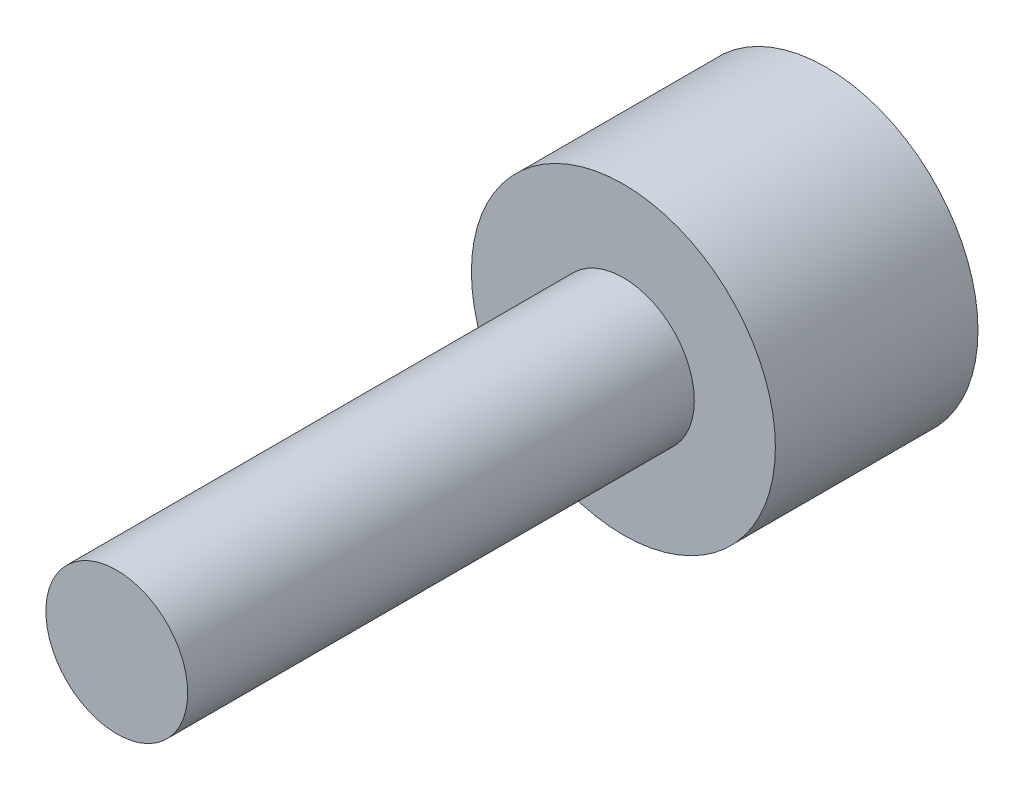
ISO-10303-21;
HEADER;
FILE_DESCRIPTION(('STEP AP214'),'2;1');
FILE_NAME('part.step','',(''),(''),'','','');
FILE_SCHEMA(('AUTOMOTIVE_DESIGN { 1 0 10303 214 1 1 1 1 }'));
ENDSEC;
DATA;
#1=APPLICATION_CONTEXT('core data for automotive mechanical design processes');
#2=APPLICATION_PROTOCOL_DEFINITION('international standard','automotive_design',2000,#1);
#3=PRODUCT_CONTEXT('',#1,'mechanical');
#4=PRODUCT('Part','Part','',(#3));
#5=PRODUCT_RELATED_PRODUCT_CATEGORY('part','',(#4));
#6=PRODUCT_DEFINITION_FORMATION('','',#4);
#7=PRODUCT_DEFINITION_CONTEXT('part definition',#1,'design');
#8=PRODUCT_DEFINITION('design','',#6,#7);
#9=PRODUCT_DEFINITION_SHAPE('','',#8);
#10=(LENGTH_UNIT() NAMED_UNIT(*) SI_UNIT(.MILLI.,.METRE.));
#11=(NAMED_UNIT(*) PLANE_ANGLE_UNIT() SI_UNIT($,.RADIAN.));
#12=(NAMED_UNIT(*) SI_UNIT($,.STERADIAN.) SOLID_ANGLE_UNIT());
#13=UNCERTAINTY_MEASURE_WITH_UNIT(LENGTH_MEASURE(1.E-05),#10,'distance_accuracy_value','');
#14=(GEOMETRIC_REPRESENTATION_CONTEXT(3) GLOBAL_UNCERTAINTY_ASSIGNED_CONTEXT((#13)) GLOBAL_UNIT_ASSIGNED_CONTEXT((#10,
#11,#12)) REPRESENTATION_CONTEXT('',''));
#15=CARTESIAN_POINT('',(0.,0.,0.));
#16=DIRECTION('',(0.,0.,1.));
#17=DIRECTION('',(1.,0.,0.));
#18=AXIS2_PLACEMENT_3D('',#15,#16,#17);
#19=CARTESIAN_POINT('',(0.,0.,35.));
#20=DIRECTION('',(0.,0.,-1.));
#21=DIRECTION('',(-1.,0.,0.));
#22=AXIS2_PLACEMENT_3D('',#19,#20,#21);
#23=CYLINDRICAL_SURFACE('',#22,3.5);
#24=CARTESIAN_POINT('',(0.,0.,35.));
#25=DIRECTION('',(0.,0.,1.));
#26=DIRECTION('',(1.,0.,0.));
#27=AXIS2_PLACEMENT_3D('',#24,#25,#26);
#28=CIRCLE('',#27,3.5);
#29=CARTESIAN_POINT('',(3.5,0.,35.));
#30=VERTEX_POINT('',#29);
#31=EDGE_CURVE('E11',#30,#30,#28,.T.);
#32=ORIENTED_EDGE('',*,*,#31,.F.);
#33=EDGE_LOOP('',(#32));
#34=FACE_BOUND('',#33,.T.);
#35=CARTESIAN_POINT('',(0.,0.,10.));
#36=DIRECTION('',(0.,0.,1.));
#37=DIRECTION('',(1.,0.,0.));
#38=AXIS2_PLACEMENT_3D('',#35,#36,#37);
#39=CIRCLE('',#38,3.5);
#40=CARTESIAN_POINT('',(3.5,0.,10.));
#41=VERTEX_POINT('',#40);
#42=EDGE_CURVE('E52',#41,#41,#39,.T.);
#43=ORIENTED_EDGE('',*,*,#42,.T.);
#44=EDGE_LOOP('',(#43));
#45=FACE_BOUND('',#44,.T.);
#46=ADVANCED_FACE('F49',(#34,#45),#23,.T.);
#47=CARTESIAN_POINT('',(0.,0.,35.));
#48=DIRECTION('',(0.,0.,1.));
#49=DIRECTION('',(1.,0.,0.));
#50=AXIS2_PLACEMENT_3D('',#47,#48,#49);
#51=PLANE('',#50);
#52=ORIENTED_EDGE('',*,*,#31,.T.);
#53=EDGE_LOOP('',(#52));
#54=FACE_BOUND('',#53,.T.);
#55=ADVANCED_FACE('F64',(#54),#51,.T.);
#56=CARTESIAN_POINT('',(0.,0.,10.));
#57=DIRECTION('',(0.,0.,1.));
#58=DIRECTION('',(1.,0.,0.));
#59=AXIS2_PLACEMENT_3D('',#56,#57,#58);
#60=PLANE('',#59);
#61=ORIENTED_EDGE('',*,*,#42,.F.);
#62=EDGE_LOOP('',(#61));
#63=FACE_BOUND('',#62,.T.);
#64=ADVANCED_FACE('F62',(#63),#60,.F.);
#65=CLOSED_SHELL('',(#46,#55,#64));
#66=MANIFOLD_SOLID_BREP('B2',#65);
#67=CARTESIAN_POINT('',(0.,0.,10.));
#68=DIRECTION('',(0.,0.,-1.));
#69=DIRECTION('',(-1.,0.,0.));
#70=AXIS2_PLACEMENT_3D('',#67,#68,#69);
#71=CYLINDRICAL_SURFACE('',#70,7.5);
#72=CARTESIAN_POINT('',(0.,0.,10.));
#73=DIRECTION('',(0.,0.,1.));
#74=DIRECTION('',(1.,0.,0.));
#75=AXIS2_PLACEMENT_3D('',#72,#73,#74);
#76=CIRCLE('',#75,7.5);
#77=CARTESIAN_POINT('',(7.5,0.,10.));
#78=VERTEX_POINT('',#77);
#79=EDGE_CURVE('E48',#78,#78,#76,.T.);
#80=ORIENTED_EDGE('',*,*,#79,.F.);
#81=EDGE_LOOP('',(#80));
#82=FACE_BOUND('',#81,.T.);
#83=CARTESIAN_POINT('',(0.,0.,0.));
#84=DIRECTION('',(0.,0.,1.));
#85=DIRECTION('',(1.,0.,0.));
#86=AXIS2_PLACEMENT_3D('',#83,#84,#85);
#87=CIRCLE('',#86,7.5);
#88=CARTESIAN_POINT('',(7.5,0.,0.));
#89=VERTEX_POINT('',#88);
#90=EDGE_CURVE('E99',#89,#89,#87,.T.);
#91=ORIENTED_EDGE('',*,*,#90,.T.);
#92=EDGE_LOOP('',(#91));
#93=FACE_BOUND('',#92,.T.);
#94=ADVANCED_FACE('F96',(#82,#93),#71,.T.);
#95=CARTESIAN_POINT('',(0.,0.,10.));
#96=DIRECTION('',(0.,0.,1.));
#97=DIRECTION('',(1.,0.,0.));
#98=AXIS2_PLACEMENT_3D('',#95,#96,#97);
#99=PLANE('',#98);
#100=CARTESIAN_POINT('',(0.,0.,10.));
#101=DIRECTION('',(0.,0.,1.));
#102=DIRECTION('',(1.,0.,0.));
#103=AXIS2_PLACEMENT_3D('',#100,#101,#102);
#104=CIRCLE('',#103,3.5);
#105=CARTESIAN_POINT('',(3.5,0.,10.));
#106=VERTEX_POINT('',#105);
#107=EDGE_CURVE('E110',#106,#106,#104,.T.);
#108=ORIENTED_EDGE('',*,*,#107,.F.);
#109=EDGE_LOOP('',(#108));
#110=FACE_BOUND('',#109,.T.);
#111=ORIENTED_EDGE('',*,*,#79,.T.);
#112=EDGE_LOOP('',(#111));
#113=FACE_BOUND('',#112,.T.);
#114=ADVANCED_FACE('F127',(#110,#113),#99,.T.);
#115=CARTESIAN_POINT('',(0.,0.,0.));
#116=DIRECTION('',(0.,0.,1.));
#117=DIRECTION('',(1.,0.,0.));
#118=AXIS2_PLACEMENT_3D('',#115,#116,#117);
#119=PLANE('',#118);
#120=CARTESIAN_POINT('',(0.,0.,0.));
#121=DIRECTION('',(0.,0.,1.));
#122=DIRECTION('',(1.,0.,0.));
#123=AXIS2_PLACEMENT_3D('',#120,#121,#122);
#124=CIRCLE('',#123,3.5);
#125=CARTESIAN_POINT('',(3.5,0.,0.));
#126=VERTEX_POINT('',#125);
#127=EDGE_CURVE('E108',#126,#126,#124,.T.);
#128=ORIENTED_EDGE('',*,*,#127,.T.);
#129=EDGE_LOOP('',(#128));
#130=FACE_BOUND('',#129,.T.);
#131=ORIENTED_EDGE('',*,*,#90,.F.);
#132=EDGE_LOOP('',(#131));
#133=FACE_BOUND('',#132,.T.);
#134=ADVANCED_FACE('F118',(#130,#133),#119,.F.);
#135=CARTESIAN_POINT('',(0.,0.,0.));
#136=DIRECTION('',(0.,0.,1.));
#137=DIRECTION('',(1.,0.,0.));
#138=AXIS2_PLACEMENT_3D('',#135,#136,#137);
#139=CYLINDRICAL_SURFACE('',#138,3.5);
#140=ORIENTED_EDGE('',*,*,#127,.F.);
#141=EDGE_LOOP('',(#140));
#142=FACE_BOUND('',#141,.T.);
#143=ORIENTED_EDGE('',*,*,#107,.T.);
#144=EDGE_LOOP('',(#143));
#145=FACE_BOUND('',#144,.T.);
#146=ADVANCED_FACE('F121',(#142,#145),#139,.F.);
#147=CLOSED_SHELL('',(#94,#114,#134,#146));
#148=MANIFOLD_SOLID_BREP('B6',#147);
#149=ADVANCED_BREP_SHAPE_REPRESENTATION('',(#18,#66,#148),#14);
#150=SHAPE_DEFINITION_REPRESENTATION(#9,#149);
ENDSEC;
END-ISO-10303-21;
